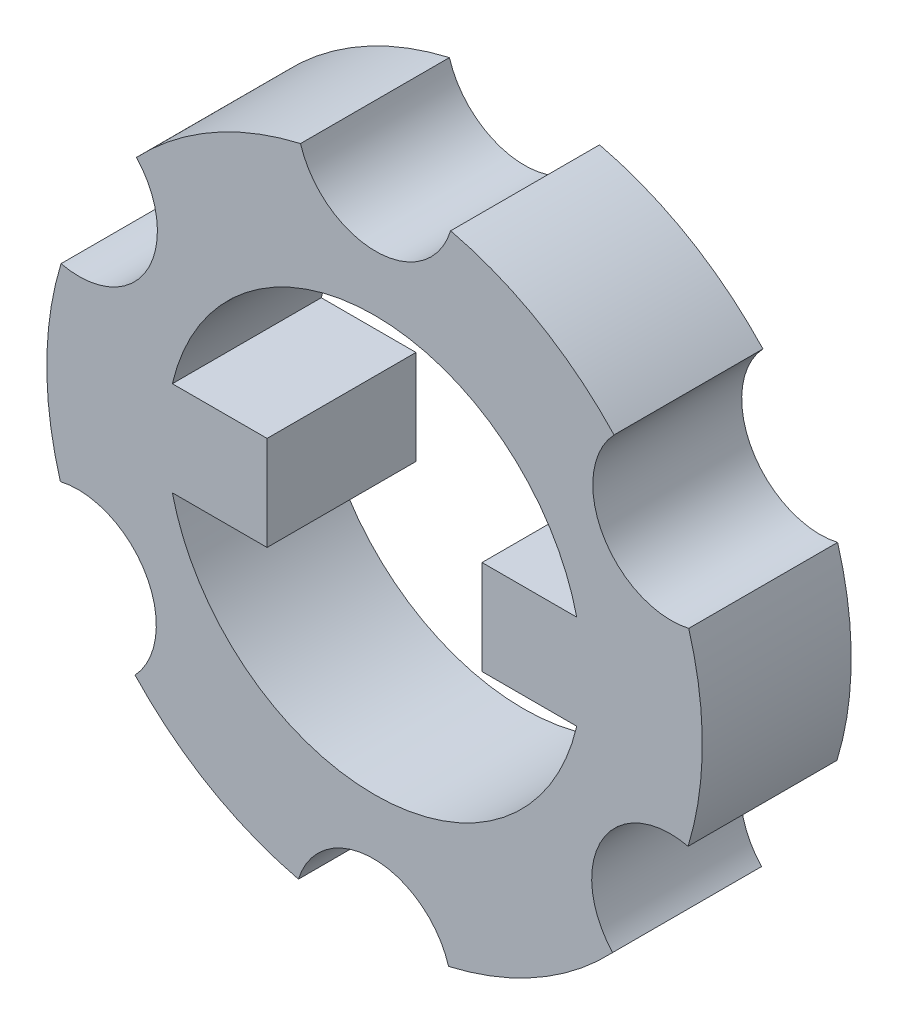
ISO-10303-21;
HEADER;
FILE_DESCRIPTION(('STEP AP214'),'2;1');
FILE_NAME('part.step','',(''),(''),'','','');
FILE_SCHEMA(('AUTOMOTIVE_DESIGN { 1 0 10303 214 1 1 1 1 }'));
ENDSEC;
DATA;
#1=APPLICATION_CONTEXT('core data for automotive mechanical design processes');
#2=APPLICATION_PROTOCOL_DEFINITION('international standard','automotive_design',2000,#1);
#3=PRODUCT_CONTEXT('',#1,'mechanical');
#4=PRODUCT('Part','Part','',(#3));
#5=PRODUCT_RELATED_PRODUCT_CATEGORY('part','',(#4));
#6=PRODUCT_DEFINITION_FORMATION('','',#4);
#7=PRODUCT_DEFINITION_CONTEXT('part definition',#1,'design');
#8=PRODUCT_DEFINITION('design','',#6,#7);
#9=PRODUCT_DEFINITION_SHAPE('','',#8);
#10=(LENGTH_UNIT() NAMED_UNIT(*) SI_UNIT(.MILLI.,.METRE.));
#11=(NAMED_UNIT(*) PLANE_ANGLE_UNIT() SI_UNIT($,.RADIAN.));
#12=(NAMED_UNIT(*) SI_UNIT($,.STERADIAN.) SOLID_ANGLE_UNIT());
#13=UNCERTAINTY_MEASURE_WITH_UNIT(LENGTH_MEASURE(1.E-05),#10,'distance_accuracy_value','');
#14=(GEOMETRIC_REPRESENTATION_CONTEXT(3) GLOBAL_UNCERTAINTY_ASSIGNED_CONTEXT((#13)) GLOBAL_UNIT_ASSIGNED_CONTEXT((#10,
#11,#12)) REPRESENTATION_CONTEXT('',''));
#15=CARTESIAN_POINT('',(0.,0.,0.));
#16=DIRECTION('',(0.,0.,1.));
#17=DIRECTION('',(1.,0.,0.));
#18=AXIS2_PLACEMENT_3D('',#15,#16,#17);
#19=CARTESIAN_POINT('',(0.,0.,32.));
#20=DIRECTION('',(0.,0.,1.));
#21=DIRECTION('',(1.,0.,0.));
#22=AXIS2_PLACEMENT_3D('',#19,#20,#21);
#23=PLANE('',#22);
#24=CARTESIAN_POINT('',(0.,0.,32.));
#25=DIRECTION('',(0.,0.,1.));
#26=DIRECTION('',(1.,0.,0.));
#27=AXIS2_PLACEMENT_3D('',#24,#25,#26);
#28=CIRCLE('',#27,6.375);
#29=CARTESIAN_POINT('',(6.20790826285312,1.45,32.));
#30=VERTEX_POINT('',#29);
#31=CARTESIAN_POINT('',(-6.20790826285312,1.45,32.));
#32=VERTEX_POINT('',#31);
#33=EDGE_CURVE('E194',#30,#32,#28,.T.);
#34=ORIENTED_EDGE('',*,*,#33,.F.);
#35=DIRECTION('',(1.,0.,0.));
#36=VECTOR('',#35,1.);
#37=CARTESIAN_POINT('',(3.3,1.45,32.));
#38=LINE('',#37,#36);
#39=CARTESIAN_POINT('',(3.3,1.45,32.));
#40=VERTEX_POINT('',#39);
#41=EDGE_CURVE('E221',#40,#30,#38,.T.);
#42=ORIENTED_EDGE('',*,*,#41,.F.);
#43=DIRECTION('',(0.,1.,0.));
#44=VECTOR('',#43,1.);
#45=CARTESIAN_POINT('',(3.3,-1.45,32.));
#46=LINE('',#45,#44);
#47=CARTESIAN_POINT('',(3.3,-1.45,32.));
#48=VERTEX_POINT('',#47);
#49=EDGE_CURVE('E218',#48,#40,#46,.T.);
#50=ORIENTED_EDGE('',*,*,#49,.F.);
#51=DIRECTION('',(-1.,0.,0.));
#52=VECTOR('',#51,1.);
#53=CARTESIAN_POINT('',(6.20790826285312,-1.45,32.));
#54=LINE('',#53,#52);
#55=CARTESIAN_POINT('',(6.20790826285312,-1.45,32.));
#56=VERTEX_POINT('',#55);
#57=EDGE_CURVE('E215',#56,#48,#54,.T.);
#58=ORIENTED_EDGE('',*,*,#57,.F.);
#59=CARTESIAN_POINT('',(0.,0.,32.));
#60=DIRECTION('',(0.,0.,1.));
#61=DIRECTION('',(1.,0.,0.));
#62=AXIS2_PLACEMENT_3D('',#59,#60,#61);
#63=CIRCLE('',#62,6.375);
#64=CARTESIAN_POINT('',(-6.20790826285312,-1.45,32.));
#65=VERTEX_POINT('',#64);
#66=EDGE_CURVE('E212',#65,#56,#63,.T.);
#67=ORIENTED_EDGE('',*,*,#66,.F.);
#68=DIRECTION('',(-1.,0.,0.));
#69=VECTOR('',#68,1.);
#70=CARTESIAN_POINT('',(-3.3,-1.45,32.));
#71=LINE('',#70,#69);
#72=CARTESIAN_POINT('',(-3.3,-1.45,32.));
#73=VERTEX_POINT('',#72);
#74=EDGE_CURVE('E209',#73,#65,#71,.T.);
#75=ORIENTED_EDGE('',*,*,#74,.F.);
#76=DIRECTION('',(0.,-1.,0.));
#77=VECTOR('',#76,1.);
#78=CARTESIAN_POINT('',(-3.3,1.45,32.));
#79=LINE('',#78,#77);
#80=CARTESIAN_POINT('',(-3.3,1.45,32.));
#81=VERTEX_POINT('',#80);
#82=EDGE_CURVE('E206',#81,#73,#79,.T.);
#83=ORIENTED_EDGE('',*,*,#82,.F.);
#84=DIRECTION('',(1.,0.,0.));
#85=VECTOR('',#84,1.);
#86=CARTESIAN_POINT('',(-6.20790826285312,1.45,32.));
#87=LINE('',#86,#85);
#88=EDGE_CURVE('E198',#32,#81,#87,.T.);
#89=ORIENTED_EDGE('',*,*,#88,.F.);
#90=EDGE_LOOP('',(#34,#42,#50,#58,#67,#75,#83,#89));
#91=FACE_BOUND('',#90,.T.);
#92=CARTESIAN_POINT('',(9.110203293059,5.22066502914051,32.));
#93=DIRECTION('',(0.,0.,-1.));
#94=DIRECTION('',(-1.,0.,0.));
#95=AXIS2_PLACEMENT_3D('',#92,#93,#94);
#96=CIRCLE('',#95,2.4097499283689);
#97=CARTESIAN_POINT('',(9.64488933725395,2.8709830184384,32.));
#98=VERTEX_POINT('',#97);
#99=CARTESIAN_POINT('',(7.35326639980508,6.8699277342294,32.));
#100=VERTEX_POINT('',#99);
#101=EDGE_CURVE('E49',#98,#100,#96,.T.);
#102=ORIENTED_EDGE('',*,*,#101,.T.);
#103=CARTESIAN_POINT('',(0.,0.,32.));
#104=DIRECTION('',(0.,0.,1.));
#105=DIRECTION('',(1.,0.,0.));
#106=AXIS2_PLACEMENT_3D('',#103,#104,#105);
#107=CIRCLE('',#106,10.0631224686991);
#108=CARTESIAN_POINT('',(2.3361004408257,9.78821069197076,32.));
#109=VERTEX_POINT('',#108);
#110=EDGE_CURVE('E193',#100,#109,#107,.T.);
#111=ORIENTED_EDGE('',*,*,#110,.T.);
#112=CARTESIAN_POINT('',(0.0338731066449188,10.5,32.));
#113=DIRECTION('',(0.,0.,-1.));
#114=DIRECTION('',(-1.,0.,0.));
#115=AXIS2_PLACEMENT_3D('',#112,#113,#114);
#116=CIRCLE('',#115,2.4097499283689);
#117=CARTESIAN_POINT('',(-2.27289874010328,9.80307937014046,32.));
#118=VERTEX_POINT('',#117);
#119=EDGE_CURVE('E244',#109,#118,#116,.T.);
#120=ORIENTED_EDGE('',*,*,#119,.T.);
#121=CARTESIAN_POINT('',(-7.3087888964283,6.91722767353245,32.));
#122=VERTEX_POINT('',#121);
#123=EDGE_CURVE('E270',#118,#122,#107,.T.);
#124=ORIENTED_EDGE('',*,*,#123,.T.);
#125=CARTESIAN_POINT('',(-9.07633018641416,5.27933497085958,32.));
#126=DIRECTION('',(0.,0.,-1.));
#127=DIRECTION('',(-1.,0.,0.));
#128=AXIS2_PLACEMENT_3D('',#125,#126,#127);
#129=CIRCLE('',#128,2.4097499283689);
#130=CARTESIAN_POINT('',(-9.62616513990844,2.93315163591113,32.));
#131=VERTEX_POINT('',#130);
#132=EDGE_CURVE('E247',#122,#131,#129,.T.);
#133=ORIENTED_EDGE('',*,*,#132,.T.);
#134=CARTESIAN_POINT('',(-9.64488933725397,-2.87098301843834,32.));
#135=VERTEX_POINT('',#134);
#136=EDGE_CURVE('E272',#131,#135,#107,.T.);
#137=ORIENTED_EDGE('',*,*,#136,.T.);
#138=CARTESIAN_POINT('',(-9.11020329305904,-5.22066502914045,32.));
#139=DIRECTION('',(0.,0.,-1.));
#140=DIRECTION('',(-1.,0.,0.));
#141=AXIS2_PLACEMENT_3D('',#138,#139,#140);
#142=CIRCLE('',#141,2.4097499283689);
#143=CARTESIAN_POINT('',(-7.35326639980512,-6.86992773422935,32.));
#144=VERTEX_POINT('',#143);
#145=EDGE_CURVE('E250',#135,#144,#142,.T.);
#146=ORIENTED_EDGE('',*,*,#145,.T.);
#147=CARTESIAN_POINT('',(-2.33610044082563,-9.78821069197077,32.));
#148=VERTEX_POINT('',#147);
#149=EDGE_CURVE('E265',#144,#148,#107,.T.);
#150=ORIENTED_EDGE('',*,*,#149,.T.);
#151=CARTESIAN_POINT('',(-0.0338731066448455,-10.5,32.));
#152=DIRECTION('',(0.,0.,-1.));
#153=DIRECTION('',(-1.,0.,0.));
#154=AXIS2_PLACEMENT_3D('',#151,#152,#153);
#155=CIRCLE('',#154,2.4097499283689);
#156=CARTESIAN_POINT('',(2.27289874010335,-9.80307937014045,32.));
#157=VERTEX_POINT('',#156);
#158=EDGE_CURVE('E243',#148,#157,#155,.T.);
#159=ORIENTED_EDGE('',*,*,#158,.T.);
#160=CARTESIAN_POINT('',(7.30878889642834,-6.91722767353239,32.));
#161=VERTEX_POINT('',#160);
#162=EDGE_CURVE('E263',#157,#161,#107,.T.);
#163=ORIENTED_EDGE('',*,*,#162,.T.);
#164=CARTESIAN_POINT('',(9.07633018641419,-5.27933497085951,32.));
#165=DIRECTION('',(0.,0.,-1.));
#166=DIRECTION('',(-1.,0.,0.));
#167=AXIS2_PLACEMENT_3D('',#164,#165,#166);
#168=CIRCLE('',#167,2.4097499283689);
#169=CARTESIAN_POINT('',(9.62616513990846,-2.93315163591106,32.));
#170=VERTEX_POINT('',#169);
#171=EDGE_CURVE('E227',#161,#170,#168,.T.);
#172=ORIENTED_EDGE('',*,*,#171,.T.);
#173=EDGE_CURVE('E257',#170,#98,#107,.T.);
#174=ORIENTED_EDGE('',*,*,#173,.T.);
#175=EDGE_LOOP('',(#102,#111,#120,#124,#133,#137,#146,#150,#159,#163,#172,#174));
#176=FACE_BOUND('',#175,.T.);
#177=ADVANCED_FACE('F42',(#91,#176),#23,.T.);
#178=CARTESIAN_POINT('',(9.110203293059,5.22066502914051,32.));
#179=DIRECTION('',(0.,0.,-1.));
#180=DIRECTION('',(-1.,0.,0.));
#181=AXIS2_PLACEMENT_3D('',#178,#179,#180);
#182=CYLINDRICAL_SURFACE('',#181,2.4097499283689);
#183=DIRECTION('',(0.,0.,1.));
#184=VECTOR('',#183,1.);
#185=CARTESIAN_POINT('',(9.64488933725395,2.8709830184384,16.));
#186=LINE('',#185,#184);
#187=CARTESIAN_POINT('',(9.64488933725395,2.8709830184384,27.428278414092));
#188=VERTEX_POINT('',#187);
#189=EDGE_CURVE('E188',#188,#98,#186,.T.);
#190=ORIENTED_EDGE('',*,*,#189,.F.);
#191=CARTESIAN_POINT('',(9.110203293059,5.22066502914051,27.428278414092));
#192=DIRECTION('',(0.,0.,1.));
#193=DIRECTION('',(1.,0.,0.));
#194=AXIS2_PLACEMENT_3D('',#191,#192,#193);
#195=CIRCLE('',#194,2.4097499283689);
#196=CARTESIAN_POINT('',(7.35326639980508,6.8699277342294,27.428278414092));
#197=VERTEX_POINT('',#196);
#198=EDGE_CURVE('E176',#188,#197,#195,.F.);
#199=ORIENTED_EDGE('',*,*,#198,.T.);
#200=DIRECTION('',(0.,0.,1.));
#201=VECTOR('',#200,1.);
#202=CARTESIAN_POINT('',(7.35326639980508,6.8699277342294,16.));
#203=LINE('',#202,#201);
#204=EDGE_CURVE('E186',#100,#197,#203,.F.);
#205=ORIENTED_EDGE('',*,*,#204,.F.);
#206=ORIENTED_EDGE('',*,*,#101,.F.);
#207=EDGE_LOOP('',(#190,#199,#205,#206));
#208=FACE_BOUND('',#207,.T.);
#209=ADVANCED_FACE('F184',(#208),#182,.F.);
#210=CARTESIAN_POINT('',(9.07633018641419,-5.27933497085951,32.));
#211=DIRECTION('',(0.,0.,-1.));
#212=DIRECTION('',(-1.,0.,0.));
#213=AXIS2_PLACEMENT_3D('',#210,#211,#212);
#214=CYLINDRICAL_SURFACE('',#213,2.4097499283689);
#215=DIRECTION('',(0.,0.,1.));
#216=VECTOR('',#215,1.);
#217=CARTESIAN_POINT('',(7.30878889642835,-6.91722767353239,16.));
#218=LINE('',#217,#216);
#219=CARTESIAN_POINT('',(7.30878889642834,-6.91722767353239,27.428278414092));
#220=VERTEX_POINT('',#219);
#221=EDGE_CURVE('E292',#220,#161,#218,.T.);
#222=ORIENTED_EDGE('',*,*,#221,.F.);
#223=CARTESIAN_POINT('',(9.07633018641419,-5.27933497085951,27.428278414092));
#224=DIRECTION('',(0.,0.,1.));
#225=DIRECTION('',(1.,0.,0.));
#226=AXIS2_PLACEMENT_3D('',#223,#224,#225);
#227=CIRCLE('',#226,2.4097499283689);
#228=CARTESIAN_POINT('',(9.62616513990846,-2.93315163591106,27.428278414092));
#229=VERTEX_POINT('',#228);
#230=EDGE_CURVE('E569',#220,#229,#227,.F.);
#231=ORIENTED_EDGE('',*,*,#230,.T.);
#232=DIRECTION('',(0.,0.,1.));
#233=VECTOR('',#232,1.);
#234=CARTESIAN_POINT('',(9.62616513990846,-2.93315163591106,16.));
#235=LINE('',#234,#233);
#236=EDGE_CURVE('E269',#170,#229,#235,.F.);
#237=ORIENTED_EDGE('',*,*,#236,.F.);
#238=ORIENTED_EDGE('',*,*,#171,.F.);
#239=EDGE_LOOP('',(#222,#231,#237,#238));
#240=FACE_BOUND('',#239,.T.);
#241=ADVANCED_FACE('F396',(#240),#214,.F.);
#242=CARTESIAN_POINT('',(-0.0338731066448455,-10.5,32.));
#243=DIRECTION('',(0.,0.,-1.));
#244=DIRECTION('',(-1.,0.,0.));
#245=AXIS2_PLACEMENT_3D('',#242,#243,#244);
#246=CYLINDRICAL_SURFACE('',#245,2.4097499283689);
#247=DIRECTION('',(0.,0.,1.));
#248=VECTOR('',#247,1.);
#249=CARTESIAN_POINT('',(-2.33610044082563,-9.78821069197077,16.));
#250=LINE('',#249,#248);
#251=CARTESIAN_POINT('',(-2.33610044082563,-9.78821069197077,27.428278414092));
#252=VERTEX_POINT('',#251);
#253=EDGE_CURVE('E286',#252,#148,#250,.T.);
#254=ORIENTED_EDGE('',*,*,#253,.F.);
#255=CARTESIAN_POINT('',(-0.0338731066448455,-10.5,27.428278414092));
#256=DIRECTION('',(0.,0.,1.));
#257=DIRECTION('',(1.,0.,0.));
#258=AXIS2_PLACEMENT_3D('',#255,#256,#257);
#259=CIRCLE('',#258,2.4097499283689);
#260=CARTESIAN_POINT('',(2.27289874010335,-9.80307937014045,27.428278414092));
#261=VERTEX_POINT('',#260);
#262=EDGE_CURVE('E289',#252,#261,#259,.F.);
#263=ORIENTED_EDGE('',*,*,#262,.T.);
#264=DIRECTION('',(0.,0.,1.));
#265=VECTOR('',#264,1.);
#266=CARTESIAN_POINT('',(2.27289874010335,-9.80307937014045,16.));
#267=LINE('',#266,#265);
#268=EDGE_CURVE('E288',#157,#261,#267,.F.);
#269=ORIENTED_EDGE('',*,*,#268,.F.);
#270=ORIENTED_EDGE('',*,*,#158,.F.);
#271=EDGE_LOOP('',(#254,#263,#269,#270));
#272=FACE_BOUND('',#271,.T.);
#273=ADVANCED_FACE('F284',(#272),#246,.F.);
#274=CARTESIAN_POINT('',(-9.11020329305904,-5.22066502914045,32.));
#275=DIRECTION('',(0.,0.,-1.));
#276=DIRECTION('',(-1.,0.,0.));
#277=AXIS2_PLACEMENT_3D('',#274,#275,#276);
#278=CYLINDRICAL_SURFACE('',#277,2.4097499283689);
#279=DIRECTION('',(0.,0.,1.));
#280=VECTOR('',#279,1.);
#281=CARTESIAN_POINT('',(-9.64488933725397,-2.87098301843834,16.));
#282=LINE('',#281,#280);
#283=CARTESIAN_POINT('',(-9.64488933725397,-2.87098301843834,27.428278414092));
#284=VERTEX_POINT('',#283);
#285=EDGE_CURVE('E303',#284,#135,#282,.T.);
#286=ORIENTED_EDGE('',*,*,#285,.F.);
#287=CARTESIAN_POINT('',(-9.11020329305904,-5.22066502914045,27.428278414092));
#288=DIRECTION('',(0.,0.,1.));
#289=DIRECTION('',(1.,0.,0.));
#290=AXIS2_PLACEMENT_3D('',#287,#288,#289);
#291=CIRCLE('',#290,2.4097499283689);
#292=CARTESIAN_POINT('',(-7.35326639980512,-6.86992773422935,27.428278414092));
#293=VERTEX_POINT('',#292);
#294=EDGE_CURVE('E325',#284,#293,#291,.F.);
#295=ORIENTED_EDGE('',*,*,#294,.T.);
#296=DIRECTION('',(0.,0.,1.));
#297=VECTOR('',#296,1.);
#298=CARTESIAN_POINT('',(-7.35326639980512,-6.86992773422935,16.));
#299=LINE('',#298,#297);
#300=EDGE_CURVE('E294',#144,#293,#299,.F.);
#301=ORIENTED_EDGE('',*,*,#300,.F.);
#302=ORIENTED_EDGE('',*,*,#145,.F.);
#303=EDGE_LOOP('',(#286,#295,#301,#302));
#304=FACE_BOUND('',#303,.T.);
#305=ADVANCED_FACE('F324',(#304),#278,.F.);
#306=CARTESIAN_POINT('',(-9.07633018641416,5.27933497085958,32.));
#307=DIRECTION('',(0.,0.,-1.));
#308=DIRECTION('',(-1.,0.,0.));
#309=AXIS2_PLACEMENT_3D('',#306,#307,#308);
#310=CYLINDRICAL_SURFACE('',#309,2.4097499283689);
#311=DIRECTION('',(0.,0.,1.));
#312=VECTOR('',#311,1.);
#313=CARTESIAN_POINT('',(-7.3087888964283,6.91722767353245,16.));
#314=LINE('',#313,#312);
#315=CARTESIAN_POINT('',(-7.3087888964283,6.91722767353245,27.428278414092));
#316=VERTEX_POINT('',#315);
#317=EDGE_CURVE('E200',#316,#122,#314,.T.);
#318=ORIENTED_EDGE('',*,*,#317,.F.);
#319=CARTESIAN_POINT('',(-9.07633018641416,5.27933497085958,27.428278414092));
#320=DIRECTION('',(0.,0.,1.));
#321=DIRECTION('',(1.,0.,0.));
#322=AXIS2_PLACEMENT_3D('',#319,#320,#321);
#323=CIRCLE('',#322,2.4097499283689);
#324=CARTESIAN_POINT('',(-9.62616513990844,2.93315163591113,27.428278414092));
#325=VERTEX_POINT('',#324);
#326=EDGE_CURVE('E316',#316,#325,#323,.F.);
#327=ORIENTED_EDGE('',*,*,#326,.T.);
#328=DIRECTION('',(0.,0.,1.));
#329=VECTOR('',#328,1.);
#330=CARTESIAN_POINT('',(-9.62616513990844,2.93315163591113,16.));
#331=LINE('',#330,#329);
#332=EDGE_CURVE('E300',#131,#325,#331,.F.);
#333=ORIENTED_EDGE('',*,*,#332,.F.);
#334=ORIENTED_EDGE('',*,*,#132,.F.);
#335=EDGE_LOOP('',(#318,#327,#333,#334));
#336=FACE_BOUND('',#335,.T.);
#337=ADVANCED_FACE('F314',(#336),#310,.F.);
#338=CARTESIAN_POINT('',(0.0338731066449188,10.5,32.));
#339=DIRECTION('',(0.,0.,-1.));
#340=DIRECTION('',(-1.,0.,0.));
#341=AXIS2_PLACEMENT_3D('',#338,#339,#340);
#342=CYLINDRICAL_SURFACE('',#341,2.4097499283689);
#343=DIRECTION('',(0.,0.,1.));
#344=VECTOR('',#343,1.);
#345=CARTESIAN_POINT('',(2.3361004408257,9.78821069197076,16.));
#346=LINE('',#345,#344);
#347=CARTESIAN_POINT('',(2.3361004408257,9.78821069197076,27.428278414092));
#348=VERTEX_POINT('',#347);
#349=EDGE_CURVE('E195',#348,#109,#346,.T.);
#350=ORIENTED_EDGE('',*,*,#349,.F.);
#351=CARTESIAN_POINT('',(0.0338731066449188,10.5,27.428278414092));
#352=DIRECTION('',(0.,0.,1.));
#353=DIRECTION('',(1.,0.,0.));
#354=AXIS2_PLACEMENT_3D('',#351,#352,#353);
#355=CIRCLE('',#354,2.4097499283689);
#356=CARTESIAN_POINT('',(-2.27289874010328,9.80307937014046,27.428278414092));
#357=VERTEX_POINT('',#356);
#358=EDGE_CURVE('E63',#348,#357,#355,.F.);
#359=ORIENTED_EDGE('',*,*,#358,.T.);
#360=DIRECTION('',(0.,0.,1.));
#361=VECTOR('',#360,1.);
#362=CARTESIAN_POINT('',(-2.27289874010328,9.80307937014046,16.));
#363=LINE('',#362,#361);
#364=EDGE_CURVE('E305',#118,#357,#363,.F.);
#365=ORIENTED_EDGE('',*,*,#364,.F.);
#366=ORIENTED_EDGE('',*,*,#119,.F.);
#367=EDGE_LOOP('',(#350,#359,#365,#366));
#368=FACE_BOUND('',#367,.T.);
#369=ADVANCED_FACE('F409',(#368),#342,.F.);
#370=CARTESIAN_POINT('',(0.,0.,-46.5865899686106));
#371=DIRECTION('',(0.,0.,1.));
#372=DIRECTION('',(1.,0.,0.));
#373=AXIS2_PLACEMENT_3D('',#370,#371,#372);
#374=CYLINDRICAL_SURFACE('',#373,6.375);
#375=DIRECTION('',(0.,0.,1.));
#376=VECTOR('',#375,1.);
#377=CARTESIAN_POINT('',(-6.20790826285312,1.45,-46.5865899686106));
#378=LINE('',#377,#376);
#379=CARTESIAN_POINT('',(-6.20790826285312,1.45,27.428278414092));
#380=VERTEX_POINT('',#379);
#381=EDGE_CURVE('E224',#380,#32,#378,.T.);
#382=ORIENTED_EDGE('',*,*,#381,.F.);
#383=CARTESIAN_POINT('',(0.,0.,27.428278414092));
#384=DIRECTION('',(0.,0.,1.));
#385=DIRECTION('',(1.,0.,0.));
#386=AXIS2_PLACEMENT_3D('',#383,#384,#385);
#387=CIRCLE('',#386,6.375);
#388=CARTESIAN_POINT('',(6.20790826285312,1.45,27.428278414092));
#389=VERTEX_POINT('',#388);
#390=EDGE_CURVE('E56',#380,#389,#387,.F.);
#391=ORIENTED_EDGE('',*,*,#390,.T.);
#392=DIRECTION('',(0.,0.,1.));
#393=VECTOR('',#392,1.);
#394=CARTESIAN_POINT('',(6.20790826285312,1.45,-46.5865899686106));
#395=LINE('',#394,#393);
#396=EDGE_CURVE('E225',#389,#30,#395,.T.);
#397=ORIENTED_EDGE('',*,*,#396,.T.);
#398=ORIENTED_EDGE('',*,*,#33,.T.);
#399=EDGE_LOOP('',(#382,#391,#397,#398));
#400=FACE_BOUND('',#399,.T.);
#401=ADVANCED_FACE('F367',(#400),#374,.F.);
#402=CARTESIAN_POINT('',(3.3,1.45,-46.5865899686106));
#403=DIRECTION('',(0.,-1.,0.));
#404=DIRECTION('',(1.,0.,0.));
#405=AXIS2_PLACEMENT_3D('',#402,#403,#404);
#406=PLANE('',#405);
#407=ORIENTED_EDGE('',*,*,#396,.F.);
#408=DIRECTION('',(-1.,0.,0.));
#409=VECTOR('',#408,1.);
#410=CARTESIAN_POINT('',(3.3,1.45,27.428278414092));
#411=LINE('',#410,#409);
#412=CARTESIAN_POINT('',(3.3,1.45,27.428278414092));
#413=VERTEX_POINT('',#412);
#414=EDGE_CURVE('E266',#389,#413,#411,.T.);
#415=ORIENTED_EDGE('',*,*,#414,.T.);
#416=DIRECTION('',(0.,0.,1.));
#417=VECTOR('',#416,1.);
#418=CARTESIAN_POINT('',(3.3,1.45,-46.5865899686106));
#419=LINE('',#418,#417);
#420=EDGE_CURVE('E228',#413,#40,#419,.T.);
#421=ORIENTED_EDGE('',*,*,#420,.T.);
#422=ORIENTED_EDGE('',*,*,#41,.T.);
#423=EDGE_LOOP('',(#407,#415,#421,#422));
#424=FACE_BOUND('',#423,.T.);
#425=ADVANCED_FACE('F354',(#424),#406,.F.);
#426=CARTESIAN_POINT('',(3.3,-1.45,-46.5865899686106));
#427=DIRECTION('',(1.,0.,0.));
#428=DIRECTION('',(0.,0.,-1.));
#429=AXIS2_PLACEMENT_3D('',#426,#427,#428);
#430=PLANE('',#429);
#431=ORIENTED_EDGE('',*,*,#420,.F.);
#432=DIRECTION('',(0.,-1.,0.));
#433=VECTOR('',#432,1.);
#434=CARTESIAN_POINT('',(3.3,-1.45,27.428278414092));
#435=LINE('',#434,#433);
#436=CARTESIAN_POINT('',(3.3,-1.45,27.428278414092));
#437=VERTEX_POINT('',#436);
#438=EDGE_CURVE('E347',#413,#437,#435,.T.);
#439=ORIENTED_EDGE('',*,*,#438,.T.);
#440=DIRECTION('',(0.,0.,1.));
#441=VECTOR('',#440,1.);
#442=CARTESIAN_POINT('',(3.3,-1.45,-46.5865899686106));
#443=LINE('',#442,#441);
#444=EDGE_CURVE('E230',#437,#48,#443,.T.);
#445=ORIENTED_EDGE('',*,*,#444,.T.);
#446=ORIENTED_EDGE('',*,*,#49,.T.);
#447=EDGE_LOOP('',(#431,#439,#445,#446));
#448=FACE_BOUND('',#447,.T.);
#449=ADVANCED_FACE('F356',(#448),#430,.F.);
#450=CARTESIAN_POINT('',(6.20790826285312,-1.45,-46.5865899686106));
#451=DIRECTION('',(0.,1.,0.));
#452=DIRECTION('',(-1.,0.,0.));
#453=AXIS2_PLACEMENT_3D('',#450,#451,#452);
#454=PLANE('',#453);
#455=ORIENTED_EDGE('',*,*,#444,.F.);
#456=DIRECTION('',(1.,0.,0.));
#457=VECTOR('',#456,1.);
#458=CARTESIAN_POINT('',(6.20790826285312,-1.45,27.428278414092));
#459=LINE('',#458,#457);
#460=CARTESIAN_POINT('',(6.20790826285312,-1.45,27.428278414092));
#461=VERTEX_POINT('',#460);
#462=EDGE_CURVE('E344',#437,#461,#459,.T.);
#463=ORIENTED_EDGE('',*,*,#462,.T.);
#464=DIRECTION('',(0.,0.,1.));
#465=VECTOR('',#464,1.);
#466=CARTESIAN_POINT('',(6.20790826285312,-1.45,-46.5865899686106));
#467=LINE('',#466,#465);
#468=EDGE_CURVE('E232',#461,#56,#467,.T.);
#469=ORIENTED_EDGE('',*,*,#468,.T.);
#470=ORIENTED_EDGE('',*,*,#57,.T.);
#471=EDGE_LOOP('',(#455,#463,#469,#470));
#472=FACE_BOUND('',#471,.T.);
#473=ADVANCED_FACE('F383',(#472),#454,.F.);
#474=CARTESIAN_POINT('',(0.,0.,-46.5865899686106));
#475=DIRECTION('',(0.,0.,1.));
#476=DIRECTION('',(1.,0.,0.));
#477=AXIS2_PLACEMENT_3D('',#474,#475,#476);
#478=CYLINDRICAL_SURFACE('',#477,6.375);
#479=ORIENTED_EDGE('',*,*,#468,.F.);
#480=CARTESIAN_POINT('',(0.,0.,27.428278414092));
#481=DIRECTION('',(0.,0.,1.));
#482=DIRECTION('',(1.,0.,0.));
#483=AXIS2_PLACEMENT_3D('',#480,#481,#482);
#484=CIRCLE('',#483,6.375);
#485=CARTESIAN_POINT('',(-6.20790826285312,-1.45,27.428278414092));
#486=VERTEX_POINT('',#485);
#487=EDGE_CURVE('E341',#461,#486,#484,.F.);
#488=ORIENTED_EDGE('',*,*,#487,.T.);
#489=DIRECTION('',(0.,0.,1.));
#490=VECTOR('',#489,1.);
#491=CARTESIAN_POINT('',(-6.20790826285312,-1.45,-46.5865899686106));
#492=LINE('',#491,#490);
#493=EDGE_CURVE('E234',#486,#65,#492,.T.);
#494=ORIENTED_EDGE('',*,*,#493,.T.);
#495=ORIENTED_EDGE('',*,*,#66,.T.);
#496=EDGE_LOOP('',(#479,#488,#494,#495));
#497=FACE_BOUND('',#496,.T.);
#498=ADVANCED_FACE('F381',(#497),#478,.F.);
#499=CARTESIAN_POINT('',(-3.3,-1.45,-46.5865899686106));
#500=DIRECTION('',(0.,1.,0.));
#501=DIRECTION('',(-1.,0.,0.));
#502=AXIS2_PLACEMENT_3D('',#499,#500,#501);
#503=PLANE('',#502);
#504=ORIENTED_EDGE('',*,*,#493,.F.);
#505=DIRECTION('',(1.,0.,0.));
#506=VECTOR('',#505,1.);
#507=CARTESIAN_POINT('',(-3.3,-1.45,27.428278414092));
#508=LINE('',#507,#506);
#509=CARTESIAN_POINT('',(-3.3,-1.45,27.428278414092));
#510=VERTEX_POINT('',#509);
#511=EDGE_CURVE('E338',#486,#510,#508,.T.);
#512=ORIENTED_EDGE('',*,*,#511,.T.);
#513=DIRECTION('',(0.,0.,1.));
#514=VECTOR('',#513,1.);
#515=CARTESIAN_POINT('',(-3.3,-1.45,-46.5865899686106));
#516=LINE('',#515,#514);
#517=EDGE_CURVE('E236',#510,#73,#516,.T.);
#518=ORIENTED_EDGE('',*,*,#517,.T.);
#519=ORIENTED_EDGE('',*,*,#74,.T.);
#520=EDGE_LOOP('',(#504,#512,#518,#519));
#521=FACE_BOUND('',#520,.T.);
#522=ADVANCED_FACE('F377',(#521),#503,.F.);
#523=CARTESIAN_POINT('',(-3.3,1.45,-46.5865899686106));
#524=DIRECTION('',(-1.,0.,0.));
#525=DIRECTION('',(0.,-1.,0.));
#526=AXIS2_PLACEMENT_3D('',#523,#524,#525);
#527=PLANE('',#526);
#528=ORIENTED_EDGE('',*,*,#517,.F.);
#529=DIRECTION('',(0.,1.,0.));
#530=VECTOR('',#529,1.);
#531=CARTESIAN_POINT('',(-3.3,1.45,27.428278414092));
#532=LINE('',#531,#530);
#533=CARTESIAN_POINT('',(-3.3,1.45,27.428278414092));
#534=VERTEX_POINT('',#533);
#535=EDGE_CURVE('E331',#510,#534,#532,.T.);
#536=ORIENTED_EDGE('',*,*,#535,.T.);
#537=DIRECTION('',(0.,0.,1.));
#538=VECTOR('',#537,1.);
#539=CARTESIAN_POINT('',(-3.3,1.45,-46.5865899686106));
#540=LINE('',#539,#538);
#541=EDGE_CURVE('E238',#534,#81,#540,.T.);
#542=ORIENTED_EDGE('',*,*,#541,.T.);
#543=ORIENTED_EDGE('',*,*,#82,.T.);
#544=EDGE_LOOP('',(#528,#536,#542,#543));
#545=FACE_BOUND('',#544,.T.);
#546=ADVANCED_FACE('F373',(#545),#527,.F.);
#547=CARTESIAN_POINT('',(-6.20790826285312,1.45,-46.5865899686106));
#548=DIRECTION('',(0.,-1.,0.));
#549=DIRECTION('',(1.,0.,0.));
#550=AXIS2_PLACEMENT_3D('',#547,#548,#549);
#551=PLANE('',#550);
#552=ORIENTED_EDGE('',*,*,#541,.F.);
#553=DIRECTION('',(-1.,0.,0.));
#554=VECTOR('',#553,1.);
#555=CARTESIAN_POINT('',(-6.20790826285312,1.45,27.428278414092));
#556=LINE('',#555,#554);
#557=EDGE_CURVE('E329',#534,#380,#556,.T.);
#558=ORIENTED_EDGE('',*,*,#557,.T.);
#559=ORIENTED_EDGE('',*,*,#381,.T.);
#560=ORIENTED_EDGE('',*,*,#88,.T.);
#561=EDGE_LOOP('',(#552,#558,#559,#560));
#562=FACE_BOUND('',#561,.T.);
#563=ADVANCED_FACE('F370',(#562),#551,.F.);
#564=CARTESIAN_POINT('',(0.,0.,0.));
#565=DIRECTION('',(0.,0.,1.));
#566=DIRECTION('',(1.,0.,0.));
#567=AXIS2_PLACEMENT_3D('',#564,#565,#566);
#568=CYLINDRICAL_SURFACE('',#567,10.0631224686991);
#569=CARTESIAN_POINT('',(0.,0.,27.428278414092));
#570=DIRECTION('',(0.,0.,1.));
#571=DIRECTION('',(1.,0.,0.));
#572=AXIS2_PLACEMENT_3D('',#569,#570,#571);
#573=CIRCLE('',#572,10.0631224686991);
#574=EDGE_CURVE('E570',#188,#229,#573,.F.);
#575=ORIENTED_EDGE('',*,*,#574,.F.);
#576=ORIENTED_EDGE('',*,*,#189,.T.);
#577=ORIENTED_EDGE('',*,*,#173,.F.);
#578=ORIENTED_EDGE('',*,*,#236,.T.);
#579=EDGE_LOOP('',(#575,#576,#577,#578));
#580=FACE_BOUND('',#579,.T.);
#581=ADVANCED_FACE('F417',(#580),#568,.T.);
#582=CARTESIAN_POINT('',(0.,0.,27.428278414092));
#583=DIRECTION('',(0.,0.,1.));
#584=DIRECTION('',(1.,0.,0.));
#585=AXIS2_PLACEMENT_3D('',#582,#583,#584);
#586=CIRCLE('',#585,10.0631224686991);
#587=EDGE_CURVE('E565',#220,#261,#586,.F.);
#588=ORIENTED_EDGE('',*,*,#587,.F.);
#589=ORIENTED_EDGE('',*,*,#221,.T.);
#590=ORIENTED_EDGE('',*,*,#162,.F.);
#591=ORIENTED_EDGE('',*,*,#268,.T.);
#592=EDGE_LOOP('',(#588,#589,#590,#591));
#593=FACE_BOUND('',#592,.T.);
#594=ADVANCED_FACE('F443',(#593),#568,.T.);
#595=CARTESIAN_POINT('',(0.,0.,27.428278414092));
#596=DIRECTION('',(0.,0.,1.));
#597=DIRECTION('',(1.,0.,0.));
#598=AXIS2_PLACEMENT_3D('',#595,#596,#597);
#599=CIRCLE('',#598,10.0631224686991);
#600=EDGE_CURVE('E328',#252,#293,#599,.F.);
#601=ORIENTED_EDGE('',*,*,#600,.F.);
#602=ORIENTED_EDGE('',*,*,#253,.T.);
#603=ORIENTED_EDGE('',*,*,#149,.F.);
#604=ORIENTED_EDGE('',*,*,#300,.T.);
#605=EDGE_LOOP('',(#601,#602,#603,#604));
#606=FACE_BOUND('',#605,.T.);
#607=ADVANCED_FACE('F327',(#606),#568,.T.);
#608=CARTESIAN_POINT('',(0.,0.,27.428278414092));
#609=DIRECTION('',(0.,0.,1.));
#610=DIRECTION('',(1.,0.,0.));
#611=AXIS2_PLACEMENT_3D('',#608,#609,#610);
#612=CIRCLE('',#611,10.0631224686991);
#613=EDGE_CURVE('E320',#284,#325,#612,.F.);
#614=ORIENTED_EDGE('',*,*,#613,.F.);
#615=ORIENTED_EDGE('',*,*,#285,.T.);
#616=ORIENTED_EDGE('',*,*,#136,.F.);
#617=ORIENTED_EDGE('',*,*,#332,.T.);
#618=EDGE_LOOP('',(#614,#615,#616,#617));
#619=FACE_BOUND('',#618,.T.);
#620=ADVANCED_FACE('F319',(#619),#568,.T.);
#621=CARTESIAN_POINT('',(0.,0.,27.428278414092));
#622=DIRECTION('',(0.,0.,1.));
#623=DIRECTION('',(1.,0.,0.));
#624=AXIS2_PLACEMENT_3D('',#621,#622,#623);
#625=CIRCLE('',#624,10.0631224686991);
#626=EDGE_CURVE('E189',#316,#357,#625,.F.);
#627=ORIENTED_EDGE('',*,*,#626,.F.);
#628=ORIENTED_EDGE('',*,*,#317,.T.);
#629=ORIENTED_EDGE('',*,*,#123,.F.);
#630=ORIENTED_EDGE('',*,*,#364,.T.);
#631=EDGE_LOOP('',(#627,#628,#629,#630));
#632=FACE_BOUND('',#631,.T.);
#633=ADVANCED_FACE('F310',(#632),#568,.T.);
#634=CARTESIAN_POINT('',(0.,0.,27.428278414092));
#635=DIRECTION('',(0.,0.,1.));
#636=DIRECTION('',(1.,0.,0.));
#637=AXIS2_PLACEMENT_3D('',#634,#635,#636);
#638=CIRCLE('',#637,10.0631224686991);
#639=EDGE_CURVE('E12',#348,#197,#638,.F.);
#640=ORIENTED_EDGE('',*,*,#639,.F.);
#641=ORIENTED_EDGE('',*,*,#349,.T.);
#642=ORIENTED_EDGE('',*,*,#110,.F.);
#643=ORIENTED_EDGE('',*,*,#204,.T.);
#644=EDGE_LOOP('',(#640,#641,#642,#643));
#645=FACE_BOUND('',#644,.T.);
#646=ADVANCED_FACE('F191',(#645),#568,.T.);
#647=CARTESIAN_POINT('',(18.9410185414617,-9.95860224424717,27.428278414092));
#648=DIRECTION('',(0.,0.,1.));
#649=DIRECTION('',(1.,0.,0.));
#650=AXIS2_PLACEMENT_3D('',#647,#648,#649);
#651=PLANE('',#650);
#652=ORIENTED_EDGE('',*,*,#600,.T.);
#653=ORIENTED_EDGE('',*,*,#294,.F.);
#654=ORIENTED_EDGE('',*,*,#613,.T.);
#655=ORIENTED_EDGE('',*,*,#326,.F.);
#656=ORIENTED_EDGE('',*,*,#626,.T.);
#657=ORIENTED_EDGE('',*,*,#358,.F.);
#658=ORIENTED_EDGE('',*,*,#639,.T.);
#659=ORIENTED_EDGE('',*,*,#198,.F.);
#660=ORIENTED_EDGE('',*,*,#574,.T.);
#661=ORIENTED_EDGE('',*,*,#230,.F.);
#662=ORIENTED_EDGE('',*,*,#587,.T.);
#663=ORIENTED_EDGE('',*,*,#262,.F.);
#664=EDGE_LOOP('',(#652,#653,#654,#655,#656,#657,#658,#659,#660,#661,#662,#663));
#665=FACE_BOUND('',#664,.T.);
#666=ORIENTED_EDGE('',*,*,#557,.F.);
#667=ORIENTED_EDGE('',*,*,#535,.F.);
#668=ORIENTED_EDGE('',*,*,#511,.F.);
#669=ORIENTED_EDGE('',*,*,#487,.F.);
#670=ORIENTED_EDGE('',*,*,#462,.F.);
#671=ORIENTED_EDGE('',*,*,#438,.F.);
#672=ORIENTED_EDGE('',*,*,#414,.F.);
#673=ORIENTED_EDGE('',*,*,#390,.F.);
#674=EDGE_LOOP('',(#666,#667,#668,#669,#670,#671,#672,#673));
#675=FACE_BOUND('',#674,.T.);
#676=ADVANCED_FACE('F175',(#665,#675),#651,.F.);
#677=CLOSED_SHELL('',(#177,#209,#241,#273,#305,#337,#369,#401,#425,#449,#473,#498,#522,#546,
#563,#581,#594,#607,#620,#633,#646,#676));
#678=MANIFOLD_SOLID_BREP('B2',#677);
#679=ADVANCED_BREP_SHAPE_REPRESENTATION('',(#18,#678),#14);
#680=SHAPE_DEFINITION_REPRESENTATION(#9,#679);
ENDSEC;
END-ISO-10303-21;
